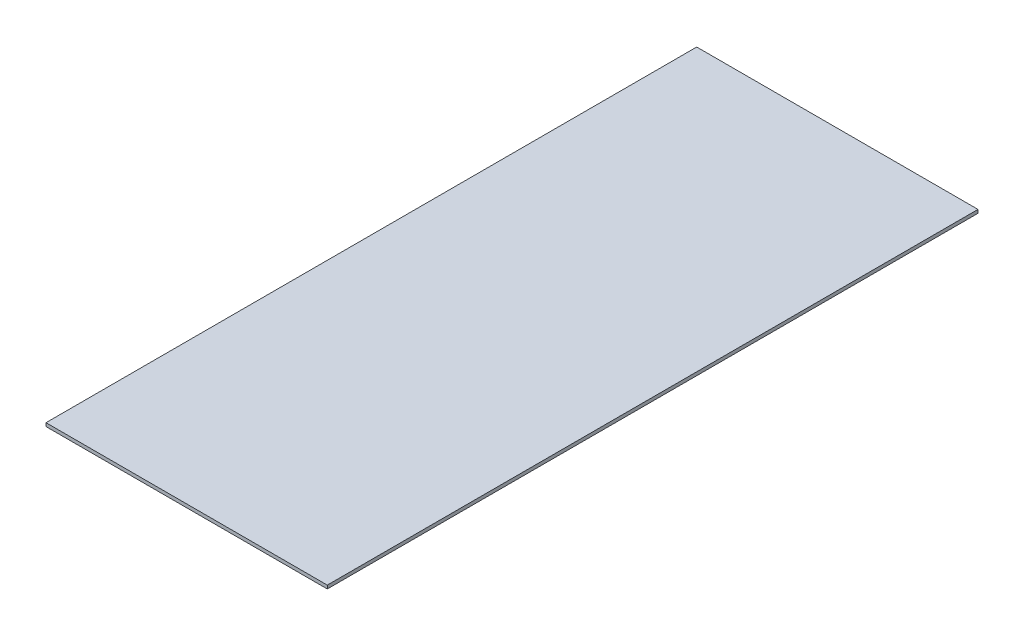
ISO-10303-21;
HEADER;
FILE_DESCRIPTION(('STEP AP214'),'2;1');
FILE_NAME('part.step','',(''),(''),'','','');
FILE_SCHEMA(('AUTOMOTIVE_DESIGN { 1 0 10303 214 1 1 1 1 }'));
ENDSEC;
DATA;
#1=APPLICATION_CONTEXT('core data for automotive mechanical design processes');
#2=APPLICATION_PROTOCOL_DEFINITION('international standard','automotive_design',2000,#1);
#3=PRODUCT_CONTEXT('',#1,'mechanical');
#4=PRODUCT('Part','Part','',(#3));
#5=PRODUCT_RELATED_PRODUCT_CATEGORY('part','',(#4));
#6=PRODUCT_DEFINITION_FORMATION('','',#4);
#7=PRODUCT_DEFINITION_CONTEXT('part definition',#1,'design');
#8=PRODUCT_DEFINITION('design','',#6,#7);
#9=PRODUCT_DEFINITION_SHAPE('','',#8);
#10=(LENGTH_UNIT() NAMED_UNIT(*) SI_UNIT(.MILLI.,.METRE.));
#11=(NAMED_UNIT(*) PLANE_ANGLE_UNIT() SI_UNIT($,.RADIAN.));
#12=(NAMED_UNIT(*) SI_UNIT($,.STERADIAN.) SOLID_ANGLE_UNIT());
#13=UNCERTAINTY_MEASURE_WITH_UNIT(LENGTH_MEASURE(1.E-05),#10,'distance_accuracy_value','');
#14=(GEOMETRIC_REPRESENTATION_CONTEXT(3) GLOBAL_UNCERTAINTY_ASSIGNED_CONTEXT((#13)) GLOBAL_UNIT_ASSIGNED_CONTEXT((#10,
#11,#12)) REPRESENTATION_CONTEXT('',''));
#15=CARTESIAN_POINT('',(0.,0.,0.));
#16=DIRECTION('',(0.,0.,1.));
#17=DIRECTION('',(1.,0.,0.));
#18=AXIS2_PLACEMENT_3D('',#15,#16,#17);
#19=CARTESIAN_POINT('',(527.05,12.7,1219.2));
#20=DIRECTION('',(-1.,0.,0.));
#21=DIRECTION('',(0.,0.,1.));
#22=AXIS2_PLACEMENT_3D('',#19,#20,#21);
#23=PLANE('',#22);
#24=DIRECTION('',(0.,0.,-1.));
#25=VECTOR('',#24,1.);
#26=CARTESIAN_POINT('',(527.05,0.,1219.2));
#27=LINE('',#26,#25);
#28=CARTESIAN_POINT('',(527.05,0.,1219.2));
#29=VERTEX_POINT('',#28);
#30=CARTESIAN_POINT('',(527.05,0.,-1219.2));
#31=VERTEX_POINT('',#30);
#32=EDGE_CURVE('E107',#29,#31,#27,.T.);
#33=ORIENTED_EDGE('',*,*,#32,.T.);
#34=DIRECTION('',(0.,-1.,0.));
#35=VECTOR('',#34,1.);
#36=CARTESIAN_POINT('',(527.05,12.7,-1219.2));
#37=LINE('',#36,#35);
#38=CARTESIAN_POINT('',(527.05,12.7,-1219.2));
#39=VERTEX_POINT('',#38);
#40=EDGE_CURVE('E11',#39,#31,#37,.T.);
#41=ORIENTED_EDGE('',*,*,#40,.F.);
#42=DIRECTION('',(0.,0.,-1.));
#43=VECTOR('',#42,1.);
#44=CARTESIAN_POINT('',(527.05,12.7,1219.2));
#45=LINE('',#44,#43);
#46=CARTESIAN_POINT('',(527.05,12.7,1219.2));
#47=VERTEX_POINT('',#46);
#48=EDGE_CURVE('E91',#47,#39,#45,.T.);
#49=ORIENTED_EDGE('',*,*,#48,.F.);
#50=DIRECTION('',(0.,-1.,0.));
#51=VECTOR('',#50,1.);
#52=CARTESIAN_POINT('',(527.05,12.7,1219.2));
#53=LINE('',#52,#51);
#54=EDGE_CURVE('E103',#47,#29,#53,.T.);
#55=ORIENTED_EDGE('',*,*,#54,.T.);
#56=EDGE_LOOP('',(#33,#41,#49,#55));
#57=FACE_BOUND('',#56,.T.);
#58=ADVANCED_FACE('F39',(#57),#23,.F.);
#59=CARTESIAN_POINT('',(-527.05,12.7,-1219.2));
#60=DIRECTION('',(0.,0.,1.));
#61=DIRECTION('',(1.,0.,0.));
#62=AXIS2_PLACEMENT_3D('',#59,#60,#61);
#63=PLANE('',#62);
#64=DIRECTION('',(-1.,0.,0.));
#65=VECTOR('',#64,1.);
#66=CARTESIAN_POINT('',(-527.05,0.,-1219.2));
#67=LINE('',#66,#65);
#68=CARTESIAN_POINT('',(-527.05,0.,-1219.2));
#69=VERTEX_POINT('',#68);
#70=EDGE_CURVE('E96',#31,#69,#67,.T.);
#71=ORIENTED_EDGE('',*,*,#70,.T.);
#72=DIRECTION('',(0.,-1.,0.));
#73=VECTOR('',#72,1.);
#74=CARTESIAN_POINT('',(-527.05,12.7,-1219.2));
#75=LINE('',#74,#73);
#76=CARTESIAN_POINT('',(-527.05,12.7,-1219.2));
#77=VERTEX_POINT('',#76);
#78=EDGE_CURVE('E48',#77,#69,#75,.T.);
#79=ORIENTED_EDGE('',*,*,#78,.F.);
#80=DIRECTION('',(-1.,0.,0.));
#81=VECTOR('',#80,1.);
#82=CARTESIAN_POINT('',(-527.05,12.7,-1219.2));
#83=LINE('',#82,#81);
#84=EDGE_CURVE('E86',#39,#77,#83,.T.);
#85=ORIENTED_EDGE('',*,*,#84,.F.);
#86=ORIENTED_EDGE('',*,*,#40,.T.);
#87=EDGE_LOOP('',(#71,#79,#85,#86));
#88=FACE_BOUND('',#87,.T.);
#89=ADVANCED_FACE('F95',(#88),#63,.F.);
#90=CARTESIAN_POINT('',(-527.05,12.7,1219.2));
#91=DIRECTION('',(1.,0.,0.));
#92=DIRECTION('',(0.,0.,-1.));
#93=AXIS2_PLACEMENT_3D('',#90,#91,#92);
#94=PLANE('',#93);
#95=DIRECTION('',(0.,0.,1.));
#96=VECTOR('',#95,1.);
#97=CARTESIAN_POINT('',(-527.05,0.,1219.2));
#98=LINE('',#97,#96);
#99=CARTESIAN_POINT('',(-527.05,0.,1219.2));
#100=VERTEX_POINT('',#99);
#101=EDGE_CURVE('E73',#69,#100,#98,.T.);
#102=ORIENTED_EDGE('',*,*,#101,.T.);
#103=DIRECTION('',(0.,-1.,0.));
#104=VECTOR('',#103,1.);
#105=CARTESIAN_POINT('',(-527.05,12.7,1219.2));
#106=LINE('',#105,#104);
#107=CARTESIAN_POINT('',(-527.05,12.7,1219.2));
#108=VERTEX_POINT('',#107);
#109=EDGE_CURVE('E98',#108,#100,#106,.T.);
#110=ORIENTED_EDGE('',*,*,#109,.F.);
#111=DIRECTION('',(0.,0.,1.));
#112=VECTOR('',#111,1.);
#113=CARTESIAN_POINT('',(-527.05,12.7,1219.2));
#114=LINE('',#113,#112);
#115=EDGE_CURVE('E89',#77,#108,#114,.T.);
#116=ORIENTED_EDGE('',*,*,#115,.F.);
#117=ORIENTED_EDGE('',*,*,#78,.T.);
#118=EDGE_LOOP('',(#102,#110,#116,#117));
#119=FACE_BOUND('',#118,.T.);
#120=ADVANCED_FACE('F99',(#119),#94,.F.);
#121=CARTESIAN_POINT('',(-527.05,12.7,1219.2));
#122=DIRECTION('',(0.,0.,-1.));
#123=DIRECTION('',(-1.,0.,0.));
#124=AXIS2_PLACEMENT_3D('',#121,#122,#123);
#125=PLANE('',#124);
#126=DIRECTION('',(1.,0.,0.));
#127=VECTOR('',#126,1.);
#128=CARTESIAN_POINT('',(-527.05,0.,1219.2));
#129=LINE('',#128,#127);
#130=EDGE_CURVE('E79',#100,#29,#129,.T.);
#131=ORIENTED_EDGE('',*,*,#130,.T.);
#132=ORIENTED_EDGE('',*,*,#54,.F.);
#133=DIRECTION('',(1.,0.,0.));
#134=VECTOR('',#133,1.);
#135=CARTESIAN_POINT('',(-527.05,12.7,1219.2));
#136=LINE('',#135,#134);
#137=EDGE_CURVE('E56',#108,#47,#136,.T.);
#138=ORIENTED_EDGE('',*,*,#137,.F.);
#139=ORIENTED_EDGE('',*,*,#109,.T.);
#140=EDGE_LOOP('',(#131,#132,#138,#139));
#141=FACE_BOUND('',#140,.T.);
#142=ADVANCED_FACE('F120',(#141),#125,.F.);
#143=CARTESIAN_POINT('',(0.,12.7,0.));
#144=DIRECTION('',(0.,-1.,0.));
#145=DIRECTION('',(0.,0.,-1.));
#146=AXIS2_PLACEMENT_3D('',#143,#144,#145);
#147=PLANE('',#146);
#148=ORIENTED_EDGE('',*,*,#48,.T.);
#149=ORIENTED_EDGE('',*,*,#84,.T.);
#150=ORIENTED_EDGE('',*,*,#115,.T.);
#151=ORIENTED_EDGE('',*,*,#137,.T.);
#152=EDGE_LOOP('',(#148,#149,#150,#151));
#153=FACE_BOUND('',#152,.T.);
#154=ADVANCED_FACE('F87',(#153),#147,.F.);
#155=CARTESIAN_POINT('',(0.,0.,0.));
#156=DIRECTION('',(0.,-1.,0.));
#157=DIRECTION('',(0.,0.,-1.));
#158=AXIS2_PLACEMENT_3D('',#155,#156,#157);
#159=PLANE('',#158);
#160=ORIENTED_EDGE('',*,*,#32,.F.);
#161=ORIENTED_EDGE('',*,*,#130,.F.);
#162=ORIENTED_EDGE('',*,*,#101,.F.);
#163=ORIENTED_EDGE('',*,*,#70,.F.);
#164=EDGE_LOOP('',(#160,#161,#162,#163));
#165=FACE_BOUND('',#164,.T.);
#166=ADVANCED_FACE('F123',(#165),#159,.T.);
#167=CLOSED_SHELL('',(#58,#89,#120,#142,#154,#166));
#168=MANIFOLD_SOLID_BREP('B2',#167);
#169=ADVANCED_BREP_SHAPE_REPRESENTATION('',(#18,#168),#14);
#170=SHAPE_DEFINITION_REPRESENTATION(#9,#169);
ENDSEC;
END-ISO-10303-21;
